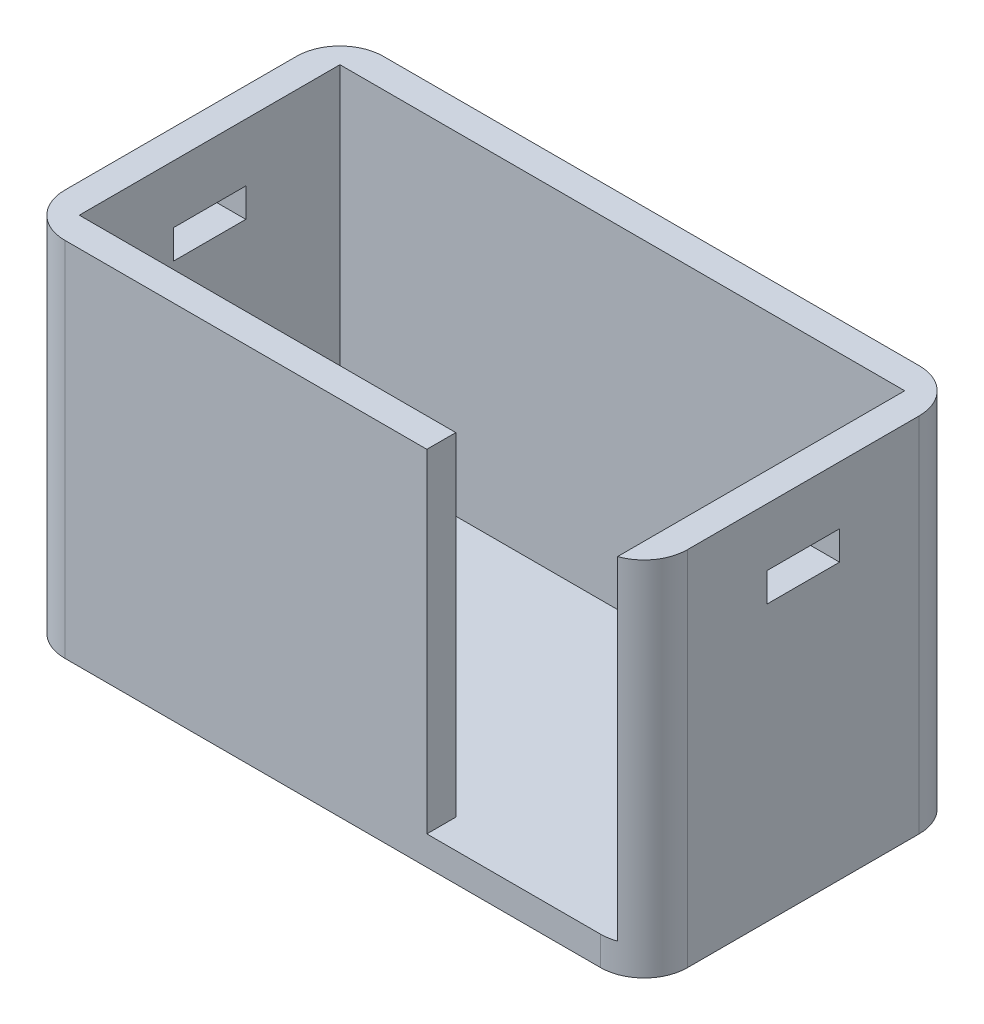
ISO-10303-21;
HEADER;
FILE_DESCRIPTION(('STEP AP214'),'2;1');
FILE_NAME('part.step','',(''),(''),'','','');
FILE_SCHEMA(('AUTOMOTIVE_DESIGN { 1 0 10303 214 1 1 1 1 }'));
ENDSEC;
DATA;
#1=APPLICATION_CONTEXT('core data for automotive mechanical design processes');
#2=APPLICATION_PROTOCOL_DEFINITION('international standard','automotive_design',2000,#1);
#3=PRODUCT_CONTEXT('',#1,'mechanical');
#4=PRODUCT('Part','Part','',(#3));
#5=PRODUCT_RELATED_PRODUCT_CATEGORY('part','',(#4));
#6=PRODUCT_DEFINITION_FORMATION('','',#4);
#7=PRODUCT_DEFINITION_CONTEXT('part definition',#1,'design');
#8=PRODUCT_DEFINITION('design','',#6,#7);
#9=PRODUCT_DEFINITION_SHAPE('','',#8);
#10=(LENGTH_UNIT() NAMED_UNIT(*) SI_UNIT(.MILLI.,.METRE.));
#11=(NAMED_UNIT(*) PLANE_ANGLE_UNIT() SI_UNIT($,.RADIAN.));
#12=(NAMED_UNIT(*) SI_UNIT($,.STERADIAN.) SOLID_ANGLE_UNIT());
#13=UNCERTAINTY_MEASURE_WITH_UNIT(LENGTH_MEASURE(1.E-05),#10,'distance_accuracy_value','');
#14=(GEOMETRIC_REPRESENTATION_CONTEXT(3) GLOBAL_UNCERTAINTY_ASSIGNED_CONTEXT((#13)) GLOBAL_UNIT_ASSIGNED_CONTEXT((#10,
#11,#12)) REPRESENTATION_CONTEXT('',''));
#15=CARTESIAN_POINT('',(0.,0.,0.));
#16=DIRECTION('',(0.,0.,1.));
#17=DIRECTION('',(1.,0.,0.));
#18=AXIS2_PLACEMENT_3D('',#15,#16,#17);
#19=CARTESIAN_POINT('',(26.,0.,20.));
#20=DIRECTION('',(-1.,0.,0.));
#21=DIRECTION('',(0.,-1.,0.));
#22=AXIS2_PLACEMENT_3D('',#19,#20,#21);
#23=PLANE('',#22);
#24=DIRECTION('',(0.,0.,-1.));
#25=VECTOR('',#24,1.);
#26=CARTESIAN_POINT('',(26.,-21.,20.));
#27=LINE('',#26,#25);
#28=CARTESIAN_POINT('',(26.,-21.,20.));
#29=VERTEX_POINT('',#28);
#30=CARTESIAN_POINT('',(26.,-21.,18.));
#31=VERTEX_POINT('',#30);
#32=EDGE_CURVE('E237',#29,#31,#27,.T.);
#33=ORIENTED_EDGE('',*,*,#32,.T.);
#34=DIRECTION('',(0.,1.,0.));
#35=VECTOR('',#34,1.);
#36=CARTESIAN_POINT('',(26.,0.,18.));
#37=LINE('',#36,#35);
#38=CARTESIAN_POINT('',(26.,2.,18.));
#39=VERTEX_POINT('',#38);
#40=EDGE_CURVE('E287',#31,#39,#37,.T.);
#41=ORIENTED_EDGE('',*,*,#40,.T.);
#42=DIRECTION('',(0.,0.,-1.));
#43=VECTOR('',#42,1.);
#44=CARTESIAN_POINT('',(26.,2.,18.));
#45=LINE('',#44,#43);
#46=CARTESIAN_POINT('',(26.,2.,20.));
#47=VERTEX_POINT('',#46);
#48=EDGE_CURVE('E211',#47,#39,#45,.T.);
#49=ORIENTED_EDGE('',*,*,#48,.F.);
#50=DIRECTION('',(0.,1.,0.));
#51=VECTOR('',#50,1.);
#52=CARTESIAN_POINT('',(26.,0.,20.));
#53=LINE('',#52,#51);
#54=EDGE_CURVE('E291',#29,#47,#53,.T.);
#55=ORIENTED_EDGE('',*,*,#54,.F.);
#56=EDGE_LOOP('',(#33,#41,#49,#55));
#57=FACE_BOUND('',#56,.T.);
#58=ADVANCED_FACE('F38',(#57),#23,.F.);
#59=CARTESIAN_POINT('',(-2.,2.,18.));
#60=DIRECTION('',(1.,0.,0.));
#61=DIRECTION('',(0.,0.,-1.));
#62=AXIS2_PLACEMENT_3D('',#59,#60,#61);
#63=PLANE('',#62);
#64=DIRECTION('',(0.,0.,-1.));
#65=VECTOR('',#64,1.);
#66=CARTESIAN_POINT('',(-2.,-3.99999999999999,18.));
#67=LINE('',#66,#65);
#68=CARTESIAN_POINT('',(-2.,-3.99999999999999,11.5));
#69=VERTEX_POINT('',#68);
#70=CARTESIAN_POINT('',(-2.,-3.99999999999998,6.5));
#71=VERTEX_POINT('',#70);
#72=EDGE_CURVE('E259',#69,#71,#67,.T.);
#73=ORIENTED_EDGE('',*,*,#72,.T.);
#74=DIRECTION('',(0.,1.,0.));
#75=VECTOR('',#74,1.);
#76=CARTESIAN_POINT('',(-2.,1.99999999999999,6.49999999999999));
#77=LINE('',#76,#75);
#78=CARTESIAN_POINT('',(-2.,-1.99999999999999,6.5));
#79=VERTEX_POINT('',#78);
#80=EDGE_CURVE('E284',#71,#79,#77,.T.);
#81=ORIENTED_EDGE('',*,*,#80,.T.);
#82=DIRECTION('',(0.,0.,1.));
#83=VECTOR('',#82,1.);
#84=CARTESIAN_POINT('',(-2.,-1.99999999999999,18.));
#85=LINE('',#84,#83);
#86=CARTESIAN_POINT('',(-2.,-1.99999999999999,11.5));
#87=VERTEX_POINT('',#86);
#88=EDGE_CURVE('E276',#79,#87,#85,.T.);
#89=ORIENTED_EDGE('',*,*,#88,.T.);
#90=DIRECTION('',(0.,-1.,0.));
#91=VECTOR('',#90,1.);
#92=CARTESIAN_POINT('',(-2.,2.,11.5));
#93=LINE('',#92,#91);
#94=EDGE_CURVE('E268',#87,#69,#93,.T.);
#95=ORIENTED_EDGE('',*,*,#94,.T.);
#96=EDGE_LOOP('',(#73,#81,#89,#95));
#97=FACE_BOUND('',#96,.T.);
#98=DIRECTION('',(0.,0.,-1.));
#99=VECTOR('',#98,1.);
#100=CARTESIAN_POINT('',(-2.,-23.,18.));
#101=LINE('',#100,#99);
#102=CARTESIAN_POINT('',(-2.,-23.,17.));
#103=VERTEX_POINT('',#102);
#104=CARTESIAN_POINT('',(-2.,-23.,1.));
#105=VERTEX_POINT('',#104);
#106=EDGE_CURVE('E310',#103,#105,#101,.T.);
#107=ORIENTED_EDGE('',*,*,#106,.F.);
#108=DIRECTION('',(0.,-1.,0.));
#109=VECTOR('',#108,1.);
#110=CARTESIAN_POINT('',(-2.,2.,17.));
#111=LINE('',#110,#109);
#112=CARTESIAN_POINT('',(-2.,2.,17.));
#113=VERTEX_POINT('',#112);
#114=EDGE_CURVE('E334',#103,#113,#111,.F.);
#115=ORIENTED_EDGE('',*,*,#114,.T.);
#116=DIRECTION('',(0.,0.,1.));
#117=VECTOR('',#116,1.);
#118=CARTESIAN_POINT('',(-2.,2.,20.));
#119=LINE('',#118,#117);
#120=CARTESIAN_POINT('',(-2.,2.,1.));
#121=VERTEX_POINT('',#120);
#122=EDGE_CURVE('E229',#121,#113,#119,.T.);
#123=ORIENTED_EDGE('',*,*,#122,.F.);
#124=DIRECTION('',(0.,1.,0.));
#125=VECTOR('',#124,1.);
#126=CARTESIAN_POINT('',(-2.,-23.,1.));
#127=LINE('',#126,#125);
#128=EDGE_CURVE('E332',#121,#105,#127,.F.);
#129=ORIENTED_EDGE('',*,*,#128,.T.);
#130=EDGE_LOOP('',(#107,#115,#123,#129));
#131=FACE_BOUND('',#130,.T.);
#132=ADVANCED_FACE('F382',(#97,#131),#63,.F.);
#133=CARTESIAN_POINT('',(41.,2.,18.));
#134=DIRECTION('',(-1.,0.,0.));
#135=DIRECTION('',(0.,0.,1.));
#136=AXIS2_PLACEMENT_3D('',#133,#134,#135);
#137=PLANE('',#136);
#138=DIRECTION('',(0.,0.,-1.));
#139=VECTOR('',#138,1.);
#140=CARTESIAN_POINT('',(41.,-2.,18.));
#141=LINE('',#140,#139);
#142=CARTESIAN_POINT('',(41.,-2.,11.5));
#143=VERTEX_POINT('',#142);
#144=CARTESIAN_POINT('',(41.,-2.,6.5));
#145=VERTEX_POINT('',#144);
#146=EDGE_CURVE('E273',#143,#145,#141,.T.);
#147=ORIENTED_EDGE('',*,*,#146,.T.);
#148=DIRECTION('',(0.,-1.,0.));
#149=VECTOR('',#148,1.);
#150=CARTESIAN_POINT('',(41.,1.99999999999999,6.49999999999999));
#151=LINE('',#150,#149);
#152=CARTESIAN_POINT('',(41.,-4.,6.5));
#153=VERTEX_POINT('',#152);
#154=EDGE_CURVE('E281',#145,#153,#151,.T.);
#155=ORIENTED_EDGE('',*,*,#154,.T.);
#156=DIRECTION('',(0.,0.,1.));
#157=VECTOR('',#156,1.);
#158=CARTESIAN_POINT('',(41.,-4.,18.));
#159=LINE('',#158,#157);
#160=CARTESIAN_POINT('',(41.,-4.,11.5));
#161=VERTEX_POINT('',#160);
#162=EDGE_CURVE('E256',#153,#161,#159,.T.);
#163=ORIENTED_EDGE('',*,*,#162,.T.);
#164=DIRECTION('',(0.,1.,0.));
#165=VECTOR('',#164,1.);
#166=CARTESIAN_POINT('',(41.,2.,11.5));
#167=LINE('',#166,#165);
#168=EDGE_CURVE('E265',#161,#143,#167,.T.);
#169=ORIENTED_EDGE('',*,*,#168,.T.);
#170=EDGE_LOOP('',(#147,#155,#163,#169));
#171=FACE_BOUND('',#170,.T.);
#172=DIRECTION('',(0.,0.,-1.));
#173=VECTOR('',#172,1.);
#174=CARTESIAN_POINT('',(41.,2.,-2.));
#175=LINE('',#174,#173);
#176=CARTESIAN_POINT('',(41.,2.,17.));
#177=VERTEX_POINT('',#176);
#178=CARTESIAN_POINT('',(41.,2.,1.));
#179=VERTEX_POINT('',#178);
#180=EDGE_CURVE('E224',#177,#179,#175,.T.);
#181=ORIENTED_EDGE('',*,*,#180,.F.);
#182=DIRECTION('',(0.,1.,0.));
#183=VECTOR('',#182,1.);
#184=CARTESIAN_POINT('',(41.,-23.,17.));
#185=LINE('',#184,#183);
#186=CARTESIAN_POINT('',(41.,-23.,17.));
#187=VERTEX_POINT('',#186);
#188=EDGE_CURVE('E46',#177,#187,#185,.F.);
#189=ORIENTED_EDGE('',*,*,#188,.T.);
#190=DIRECTION('',(0.,0.,-1.));
#191=VECTOR('',#190,1.);
#192=CARTESIAN_POINT('',(41.,-23.,18.));
#193=LINE('',#192,#191);
#194=CARTESIAN_POINT('',(41.,-23.,1.));
#195=VERTEX_POINT('',#194);
#196=EDGE_CURVE('E308',#187,#195,#193,.T.);
#197=ORIENTED_EDGE('',*,*,#196,.T.);
#198=DIRECTION('',(0.,-1.,0.));
#199=VECTOR('',#198,1.);
#200=CARTESIAN_POINT('',(41.,2.,1.));
#201=LINE('',#200,#199);
#202=EDGE_CURVE('E348',#195,#179,#201,.F.);
#203=ORIENTED_EDGE('',*,*,#202,.T.);
#204=EDGE_LOOP('',(#181,#189,#197,#203));
#205=FACE_BOUND('',#204,.T.);
#206=ADVANCED_FACE('F397',(#171,#205),#137,.F.);
#207=CARTESIAN_POINT('',(0.,0.,-2.));
#208=DIRECTION('',(0.,0.,-1.));
#209=DIRECTION('',(-1.,0.,0.));
#210=AXIS2_PLACEMENT_3D('',#207,#208,#209);
#211=PLANE('',#210);
#212=DIRECTION('',(-1.,0.,0.));
#213=VECTOR('',#212,1.);
#214=CARTESIAN_POINT('',(41.,-23.,-2.));
#215=LINE('',#214,#213);
#216=CARTESIAN_POINT('',(38.,-23.,-2.));
#217=VERTEX_POINT('',#216);
#218=CARTESIAN_POINT('',(1.,-23.,-2.));
#219=VERTEX_POINT('',#218);
#220=EDGE_CURVE('E294',#217,#219,#215,.T.);
#221=ORIENTED_EDGE('',*,*,#220,.T.);
#222=DIRECTION('',(0.,1.,0.));
#223=VECTOR('',#222,1.);
#224=CARTESIAN_POINT('',(1.,2.,-2.));
#225=LINE('',#224,#223);
#226=CARTESIAN_POINT('',(1.,2.,-2.));
#227=VERTEX_POINT('',#226);
#228=EDGE_CURVE('E345',#219,#227,#225,.T.);
#229=ORIENTED_EDGE('',*,*,#228,.T.);
#230=DIRECTION('',(-1.,0.,0.));
#231=VECTOR('',#230,1.);
#232=CARTESIAN_POINT('',(-2.,2.,-2.));
#233=LINE('',#232,#231);
#234=CARTESIAN_POINT('',(38.,2.,-2.));
#235=VERTEX_POINT('',#234);
#236=EDGE_CURVE('E226',#235,#227,#233,.T.);
#237=ORIENTED_EDGE('',*,*,#236,.F.);
#238=DIRECTION('',(0.,-1.,0.));
#239=VECTOR('',#238,1.);
#240=CARTESIAN_POINT('',(38.,-23.,-2.));
#241=LINE('',#240,#239);
#242=EDGE_CURVE('E342',#235,#217,#241,.T.);
#243=ORIENTED_EDGE('',*,*,#242,.T.);
#244=EDGE_LOOP('',(#221,#229,#237,#243));
#245=FACE_BOUND('',#244,.T.);
#246=ADVANCED_FACE('F390',(#245),#211,.T.);
#247=CARTESIAN_POINT('',(-2.,-23.,18.));
#248=DIRECTION('',(0.,1.,0.));
#249=DIRECTION('',(-1.,0.,0.));
#250=AXIS2_PLACEMENT_3D('',#247,#248,#249);
#251=PLANE('',#250);
#252=CARTESIAN_POINT('',(29.5,-23.,7.00000000000002));
#253=DIRECTION('',(0.,-1.,0.));
#254=DIRECTION('',(1.,0.,0.));
#255=AXIS2_PLACEMENT_3D('',#252,#253,#254);
#256=CIRCLE('',#255,1.25);
#257=CARTESIAN_POINT('',(30.75,-23.,7.00000000000002));
#258=VERTEX_POINT('',#257);
#259=EDGE_CURVE('E215',#258,#258,#256,.T.);
#260=ORIENTED_EDGE('',*,*,#259,.F.);
#261=EDGE_LOOP('',(#260));
#262=FACE_BOUND('',#261,.T.);
#263=CARTESIAN_POINT('',(9.5,-23.,7.));
#264=DIRECTION('',(0.,-1.,0.));
#265=DIRECTION('',(1.,0.,0.));
#266=AXIS2_PLACEMENT_3D('',#263,#264,#265);
#267=CIRCLE('',#266,1.25);
#268=CARTESIAN_POINT('',(10.75,-23.,7.));
#269=VERTEX_POINT('',#268);
#270=EDGE_CURVE('E768',#269,#269,#267,.T.);
#271=ORIENTED_EDGE('',*,*,#270,.F.);
#272=EDGE_LOOP('',(#271));
#273=FACE_BOUND('',#272,.T.);
#274=ORIENTED_EDGE('',*,*,#196,.F.);
#275=CARTESIAN_POINT('',(38.,-23.,17.));
#276=DIRECTION('',(0.,1.,0.));
#277=DIRECTION('',(-1.,0.,0.));
#278=AXIS2_PLACEMENT_3D('',#275,#276,#277);
#279=CIRCLE('',#278,3.);
#280=CARTESIAN_POINT('',(38.,-23.,20.));
#281=VERTEX_POINT('',#280);
#282=EDGE_CURVE('E11',#187,#281,#279,.F.);
#283=ORIENTED_EDGE('',*,*,#282,.T.);
#284=DIRECTION('',(1.,0.,0.));
#285=VECTOR('',#284,1.);
#286=CARTESIAN_POINT('',(-2.,-23.,20.));
#287=LINE('',#286,#285);
#288=CARTESIAN_POINT('',(1.,-23.,20.));
#289=VERTEX_POINT('',#288);
#290=EDGE_CURVE('E288',#289,#281,#287,.T.);
#291=ORIENTED_EDGE('',*,*,#290,.F.);
#292=CARTESIAN_POINT('',(1.,-23.,17.));
#293=DIRECTION('',(0.,1.,0.));
#294=DIRECTION('',(-1.,0.,0.));
#295=AXIS2_PLACEMENT_3D('',#292,#293,#294);
#296=CIRCLE('',#295,3.);
#297=EDGE_CURVE('E330',#289,#103,#296,.F.);
#298=ORIENTED_EDGE('',*,*,#297,.T.);
#299=ORIENTED_EDGE('',*,*,#106,.T.);
#300=CARTESIAN_POINT('',(1.,-23.,1.));
#301=DIRECTION('',(0.,1.,0.));
#302=DIRECTION('',(-1.,0.,0.));
#303=AXIS2_PLACEMENT_3D('',#300,#301,#302);
#304=CIRCLE('',#303,3.);
#305=EDGE_CURVE('E328',#105,#219,#304,.F.);
#306=ORIENTED_EDGE('',*,*,#305,.T.);
#307=ORIENTED_EDGE('',*,*,#220,.F.);
#308=CARTESIAN_POINT('',(38.,-23.,1.));
#309=DIRECTION('',(0.,1.,0.));
#310=DIRECTION('',(-1.,0.,0.));
#311=AXIS2_PLACEMENT_3D('',#308,#309,#310);
#312=CIRCLE('',#311,3.);
#313=EDGE_CURVE('E325',#217,#195,#312,.F.);
#314=ORIENTED_EDGE('',*,*,#313,.T.);
#315=EDGE_LOOP('',(#274,#283,#291,#298,#299,#306,#307,#314));
#316=FACE_BOUND('',#315,.T.);
#317=ADVANCED_FACE('F369',(#262,#273,#316),#251,.F.);
#318=CARTESIAN_POINT('',(0.,0.,18.));
#319=DIRECTION('',(1.,0.,0.));
#320=DIRECTION('',(0.,1.,0.));
#321=AXIS2_PLACEMENT_3D('',#318,#319,#320);
#322=PLANE('',#321);
#323=DIRECTION('',(0.,1.,0.));
#324=VECTOR('',#323,1.);
#325=CARTESIAN_POINT('',(0.,0.,6.5));
#326=LINE('',#325,#324);
#327=CARTESIAN_POINT('',(0.,-3.99999999999999,6.5));
#328=VERTEX_POINT('',#327);
#329=CARTESIAN_POINT('',(0.,-1.99999999999999,6.5));
#330=VERTEX_POINT('',#329);
#331=EDGE_CURVE('E279',#328,#330,#326,.T.);
#332=ORIENTED_EDGE('',*,*,#331,.F.);
#333=DIRECTION('',(0.,0.,-1.));
#334=VECTOR('',#333,1.);
#335=CARTESIAN_POINT('',(0.,-3.99999999999999,18.));
#336=LINE('',#335,#334);
#337=CARTESIAN_POINT('',(0.,-3.99999999999999,11.5));
#338=VERTEX_POINT('',#337);
#339=EDGE_CURVE('E254',#338,#328,#336,.T.);
#340=ORIENTED_EDGE('',*,*,#339,.F.);
#341=DIRECTION('',(0.,-1.,0.));
#342=VECTOR('',#341,1.);
#343=CARTESIAN_POINT('',(0.,0.,11.5));
#344=LINE('',#343,#342);
#345=CARTESIAN_POINT('',(0.,-1.99999999999999,11.5));
#346=VERTEX_POINT('',#345);
#347=EDGE_CURVE('E262',#346,#338,#344,.T.);
#348=ORIENTED_EDGE('',*,*,#347,.F.);
#349=DIRECTION('',(0.,0.,1.));
#350=VECTOR('',#349,1.);
#351=CARTESIAN_POINT('',(0.,-1.99999999999999,18.));
#352=LINE('',#351,#350);
#353=EDGE_CURVE('E271',#330,#346,#352,.T.);
#354=ORIENTED_EDGE('',*,*,#353,.F.);
#355=EDGE_LOOP('',(#332,#340,#348,#354));
#356=FACE_BOUND('',#355,.T.);
#357=DIRECTION('',(0.,-1.,0.));
#358=VECTOR('',#357,1.);
#359=CARTESIAN_POINT('',(0.,0.,0.));
#360=LINE('',#359,#358);
#361=CARTESIAN_POINT('',(0.,2.,0.));
#362=VERTEX_POINT('',#361);
#363=CARTESIAN_POINT('',(0.,-21.,0.));
#364=VERTEX_POINT('',#363);
#365=EDGE_CURVE('E203',#362,#364,#360,.T.);
#366=ORIENTED_EDGE('',*,*,#365,.F.);
#367=DIRECTION('',(0.,0.,-1.));
#368=VECTOR('',#367,1.);
#369=CARTESIAN_POINT('',(0.,2.,0.));
#370=LINE('',#369,#368);
#371=CARTESIAN_POINT('',(0.,2.,18.));
#372=VERTEX_POINT('',#371);
#373=EDGE_CURVE('E200',#372,#362,#370,.T.);
#374=ORIENTED_EDGE('',*,*,#373,.F.);
#375=DIRECTION('',(0.,-1.,0.));
#376=VECTOR('',#375,1.);
#377=CARTESIAN_POINT('',(0.,0.,18.));
#378=LINE('',#377,#376);
#379=CARTESIAN_POINT('',(0.,-21.,18.));
#380=VERTEX_POINT('',#379);
#381=EDGE_CURVE('E186',#372,#380,#378,.T.);
#382=ORIENTED_EDGE('',*,*,#381,.T.);
#383=DIRECTION('',(0.,0.,-1.));
#384=VECTOR('',#383,1.);
#385=CARTESIAN_POINT('',(0.,-21.,18.));
#386=LINE('',#385,#384);
#387=EDGE_CURVE('E306',#380,#364,#386,.T.);
#388=ORIENTED_EDGE('',*,*,#387,.T.);
#389=EDGE_LOOP('',(#366,#374,#382,#388));
#390=FACE_BOUND('',#389,.T.);
#391=ADVANCED_FACE('F201',(#356,#390),#322,.T.);
#392=CARTESIAN_POINT('',(0.,-21.,18.));
#393=DIRECTION('',(0.,1.,0.));
#394=DIRECTION('',(-1.,0.,0.));
#395=AXIS2_PLACEMENT_3D('',#392,#393,#394);
#396=PLANE('',#395);
#397=CARTESIAN_POINT('',(29.5,-21.,7.00000000000002));
#398=DIRECTION('',(0.,-1.,0.));
#399=DIRECTION('',(1.,0.,0.));
#400=AXIS2_PLACEMENT_3D('',#397,#398,#399);
#401=CIRCLE('',#400,1.25);
#402=CARTESIAN_POINT('',(30.75,-21.,7.00000000000002));
#403=VERTEX_POINT('',#402);
#404=EDGE_CURVE('E212',#403,#403,#401,.T.);
#405=ORIENTED_EDGE('',*,*,#404,.T.);
#406=EDGE_LOOP('',(#405));
#407=FACE_BOUND('',#406,.T.);
#408=CARTESIAN_POINT('',(9.5,-21.,7.));
#409=DIRECTION('',(0.,-1.,0.));
#410=DIRECTION('',(1.,0.,0.));
#411=AXIS2_PLACEMENT_3D('',#408,#409,#410);
#412=CIRCLE('',#411,1.25);
#413=CARTESIAN_POINT('',(10.75,-21.,7.));
#414=VERTEX_POINT('',#413);
#415=EDGE_CURVE('E218',#414,#414,#412,.T.);
#416=ORIENTED_EDGE('',*,*,#415,.T.);
#417=EDGE_LOOP('',(#416));
#418=FACE_BOUND('',#417,.T.);
#419=DIRECTION('',(-1.,0.,0.));
#420=VECTOR('',#419,1.);
#421=CARTESIAN_POINT('',(26.,-21.,20.));
#422=LINE('',#421,#420);
#423=CARTESIAN_POINT('',(38.,-21.,20.));
#424=VERTEX_POINT('',#423);
#425=EDGE_CURVE('E235',#424,#29,#422,.T.);
#426=ORIENTED_EDGE('',*,*,#425,.F.);
#427=CARTESIAN_POINT('',(38.,-21.,17.));
#428=DIRECTION('',(0.,1.,0.));
#429=DIRECTION('',(-1.,0.,0.));
#430=AXIS2_PLACEMENT_3D('',#427,#428,#429);
#431=CIRCLE('',#430,3.);
#432=CARTESIAN_POINT('',(39.,-21.,19.8284271247462));
#433=VERTEX_POINT('',#432);
#434=EDGE_CURVE('E354',#424,#433,#431,.T.);
#435=ORIENTED_EDGE('',*,*,#434,.T.);
#436=DIRECTION('',(0.,0.,-1.));
#437=VECTOR('',#436,1.);
#438=CARTESIAN_POINT('',(39.,-21.,18.));
#439=LINE('',#438,#437);
#440=CARTESIAN_POINT('',(39.,-21.,0.));
#441=VERTEX_POINT('',#440);
#442=EDGE_CURVE('E299',#433,#441,#439,.T.);
#443=ORIENTED_EDGE('',*,*,#442,.T.);
#444=DIRECTION('',(1.,0.,0.));
#445=VECTOR('',#444,1.);
#446=CARTESIAN_POINT('',(0.,-21.,0.));
#447=LINE('',#446,#445);
#448=EDGE_CURVE('E301',#364,#441,#447,.T.);
#449=ORIENTED_EDGE('',*,*,#448,.F.);
#450=ORIENTED_EDGE('',*,*,#387,.F.);
#451=DIRECTION('',(1.,0.,0.));
#452=VECTOR('',#451,1.);
#453=CARTESIAN_POINT('',(0.,-21.,18.));
#454=LINE('',#453,#452);
#455=EDGE_CURVE('E193',#380,#31,#454,.T.);
#456=ORIENTED_EDGE('',*,*,#455,.T.);
#457=ORIENTED_EDGE('',*,*,#32,.F.);
#458=EDGE_LOOP('',(#426,#435,#443,#449,#450,#456,#457));
#459=FACE_BOUND('',#458,.T.);
#460=ADVANCED_FACE('F402',(#407,#418,#459),#396,.T.);
#461=CARTESIAN_POINT('',(39.,0.,18.));
#462=DIRECTION('',(-1.,0.,0.));
#463=DIRECTION('',(0.,-1.,0.));
#464=AXIS2_PLACEMENT_3D('',#461,#462,#463);
#465=PLANE('',#464);
#466=DIRECTION('',(0.,-1.,0.));
#467=VECTOR('',#466,1.);
#468=CARTESIAN_POINT('',(39.,0.,6.5));
#469=LINE('',#468,#467);
#470=CARTESIAN_POINT('',(39.,-2.,6.5));
#471=VERTEX_POINT('',#470);
#472=CARTESIAN_POINT('',(39.,-4.,6.5));
#473=VERTEX_POINT('',#472);
#474=EDGE_CURVE('E319',#471,#473,#469,.T.);
#475=ORIENTED_EDGE('',*,*,#474,.F.);
#476=DIRECTION('',(0.,0.,-1.));
#477=VECTOR('',#476,1.);
#478=CARTESIAN_POINT('',(39.,-2.,18.));
#479=LINE('',#478,#477);
#480=CARTESIAN_POINT('',(39.,-2.,11.5));
#481=VERTEX_POINT('',#480);
#482=EDGE_CURVE('E317',#481,#471,#479,.T.);
#483=ORIENTED_EDGE('',*,*,#482,.F.);
#484=DIRECTION('',(0.,1.,0.));
#485=VECTOR('',#484,1.);
#486=CARTESIAN_POINT('',(39.,0.,11.5));
#487=LINE('',#486,#485);
#488=CARTESIAN_POINT('',(39.,-4.,11.5));
#489=VERTEX_POINT('',#488);
#490=EDGE_CURVE('E315',#489,#481,#487,.T.);
#491=ORIENTED_EDGE('',*,*,#490,.F.);
#492=DIRECTION('',(0.,0.,1.));
#493=VECTOR('',#492,1.);
#494=CARTESIAN_POINT('',(39.,-4.,18.));
#495=LINE('',#494,#493);
#496=EDGE_CURVE('E313',#473,#489,#495,.T.);
#497=ORIENTED_EDGE('',*,*,#496,.F.);
#498=EDGE_LOOP('',(#475,#483,#491,#497));
#499=FACE_BOUND('',#498,.T.);
#500=ORIENTED_EDGE('',*,*,#442,.F.);
#501=DIRECTION('',(0.,-1.,0.));
#502=VECTOR('',#501,1.);
#503=CARTESIAN_POINT('',(39.,-21.,19.8284271247462));
#504=LINE('',#503,#502);
#505=CARTESIAN_POINT('',(39.,2.,19.8284271247462));
#506=VERTEX_POINT('',#505);
#507=EDGE_CURVE('E356',#433,#506,#504,.F.);
#508=ORIENTED_EDGE('',*,*,#507,.T.);
#509=DIRECTION('',(0.,0.,1.));
#510=VECTOR('',#509,1.);
#511=CARTESIAN_POINT('',(39.,2.,20.));
#512=LINE('',#511,#510);
#513=CARTESIAN_POINT('',(39.,2.,0.));
#514=VERTEX_POINT('',#513);
#515=EDGE_CURVE('E222',#514,#506,#512,.T.);
#516=ORIENTED_EDGE('',*,*,#515,.F.);
#517=DIRECTION('',(0.,1.,0.));
#518=VECTOR('',#517,1.);
#519=CARTESIAN_POINT('',(39.,0.,0.));
#520=LINE('',#519,#518);
#521=EDGE_CURVE('E197',#441,#514,#520,.T.);
#522=ORIENTED_EDGE('',*,*,#521,.F.);
#523=EDGE_LOOP('',(#500,#508,#516,#522));
#524=FACE_BOUND('',#523,.T.);
#525=ADVANCED_FACE('F362',(#499,#524),#465,.T.);
#526=CARTESIAN_POINT('',(0.,0.,0.));
#527=DIRECTION('',(0.,0.,-1.));
#528=DIRECTION('',(-1.,0.,0.));
#529=AXIS2_PLACEMENT_3D('',#526,#527,#528);
#530=PLANE('',#529);
#531=ORIENTED_EDGE('',*,*,#521,.T.);
#532=DIRECTION('',(1.,0.,0.));
#533=VECTOR('',#532,1.);
#534=CARTESIAN_POINT('',(39.,2.,0.));
#535=LINE('',#534,#533);
#536=EDGE_CURVE('E206',#362,#514,#535,.T.);
#537=ORIENTED_EDGE('',*,*,#536,.F.);
#538=ORIENTED_EDGE('',*,*,#365,.T.);
#539=ORIENTED_EDGE('',*,*,#448,.T.);
#540=EDGE_LOOP('',(#531,#537,#538,#539));
#541=FACE_BOUND('',#540,.T.);
#542=ADVANCED_FACE('F404',(#541),#530,.F.);
#543=CARTESIAN_POINT('',(0.,0.,20.));
#544=DIRECTION('',(0.,0.,1.));
#545=DIRECTION('',(1.,0.,0.));
#546=AXIS2_PLACEMENT_3D('',#543,#544,#545);
#547=PLANE('',#546);
#548=ORIENTED_EDGE('',*,*,#290,.T.);
#549=DIRECTION('',(0.,1.,0.));
#550=VECTOR('',#549,1.);
#551=CARTESIAN_POINT('',(38.,2.,20.));
#552=LINE('',#551,#550);
#553=EDGE_CURVE('E351',#281,#424,#552,.T.);
#554=ORIENTED_EDGE('',*,*,#553,.T.);
#555=ORIENTED_EDGE('',*,*,#425,.T.);
#556=ORIENTED_EDGE('',*,*,#54,.T.);
#557=DIRECTION('',(1.,0.,0.));
#558=VECTOR('',#557,1.);
#559=CARTESIAN_POINT('',(26.,2.,20.));
#560=LINE('',#559,#558);
#561=CARTESIAN_POINT('',(1.,2.,20.));
#562=VERTEX_POINT('',#561);
#563=EDGE_CURVE('E232',#562,#47,#560,.T.);
#564=ORIENTED_EDGE('',*,*,#563,.F.);
#565=DIRECTION('',(0.,-1.,0.));
#566=VECTOR('',#565,1.);
#567=CARTESIAN_POINT('',(1.,-23.,20.));
#568=LINE('',#567,#566);
#569=EDGE_CURVE('E322',#562,#289,#568,.T.);
#570=ORIENTED_EDGE('',*,*,#569,.T.);
#571=EDGE_LOOP('',(#548,#554,#555,#556,#564,#570));
#572=FACE_BOUND('',#571,.T.);
#573=ADVANCED_FACE('F371',(#572),#547,.T.);
#574=CARTESIAN_POINT('',(0.,0.,18.));
#575=DIRECTION('',(0.,0.,1.));
#576=DIRECTION('',(1.,0.,0.));
#577=AXIS2_PLACEMENT_3D('',#574,#575,#576);
#578=PLANE('',#577);
#579=ORIENTED_EDGE('',*,*,#455,.F.);
#580=ORIENTED_EDGE('',*,*,#381,.F.);
#581=DIRECTION('',(-1.,0.,0.));
#582=VECTOR('',#581,1.);
#583=CARTESIAN_POINT('',(0.,2.,18.));
#584=LINE('',#583,#582);
#585=EDGE_CURVE('E191',#39,#372,#584,.T.);
#586=ORIENTED_EDGE('',*,*,#585,.F.);
#587=ORIENTED_EDGE('',*,*,#40,.F.);
#588=EDGE_LOOP('',(#579,#580,#586,#587));
#589=FACE_BOUND('',#588,.T.);
#590=ADVANCED_FACE('F188',(#589),#578,.F.);
#591=CARTESIAN_POINT('',(96.5,-4.00000000000002,6.5));
#592=DIRECTION('',(0.,-1.,0.));
#593=DIRECTION('',(1.,0.,0.));
#594=AXIS2_PLACEMENT_3D('',#591,#592,#593);
#595=PLANE('',#594);
#596=DIRECTION('',(-1.,0.,0.));
#597=VECTOR('',#596,1.);
#598=CARTESIAN_POINT('',(96.5,-4.00000000000002,6.5));
#599=LINE('',#598,#597);
#600=EDGE_CURVE('E252',#153,#473,#599,.T.);
#601=ORIENTED_EDGE('',*,*,#600,.T.);
#602=ORIENTED_EDGE('',*,*,#496,.T.);
#603=DIRECTION('',(-1.,0.,0.));
#604=VECTOR('',#603,1.);
#605=CARTESIAN_POINT('',(96.5,-4.00000000000002,11.5));
#606=LINE('',#605,#604);
#607=EDGE_CURVE('E248',#161,#489,#606,.T.);
#608=ORIENTED_EDGE('',*,*,#607,.F.);
#609=ORIENTED_EDGE('',*,*,#162,.F.);
#610=EDGE_LOOP('',(#601,#602,#608,#609));
#611=FACE_BOUND('',#610,.T.);
#612=ADVANCED_FACE('F512',(#611),#595,.F.);
#613=CARTESIAN_POINT('',(96.5,-2.00000000000002,11.5));
#614=DIRECTION('',(0.,0.,1.));
#615=DIRECTION('',(1.,0.,0.));
#616=AXIS2_PLACEMENT_3D('',#613,#614,#615);
#617=PLANE('',#616);
#618=ORIENTED_EDGE('',*,*,#607,.T.);
#619=ORIENTED_EDGE('',*,*,#490,.T.);
#620=DIRECTION('',(-1.,0.,0.));
#621=VECTOR('',#620,1.);
#622=CARTESIAN_POINT('',(96.5,-2.00000000000002,11.5));
#623=LINE('',#622,#621);
#624=EDGE_CURVE('E244',#143,#481,#623,.T.);
#625=ORIENTED_EDGE('',*,*,#624,.F.);
#626=ORIENTED_EDGE('',*,*,#168,.F.);
#627=EDGE_LOOP('',(#618,#619,#625,#626));
#628=FACE_BOUND('',#627,.T.);
#629=ADVANCED_FACE('F588',(#628),#617,.F.);
#630=CARTESIAN_POINT('',(96.5,-2.00000000000002,6.5));
#631=DIRECTION('',(0.,1.,0.));
#632=DIRECTION('',(-1.,0.,0.));
#633=AXIS2_PLACEMENT_3D('',#630,#631,#632);
#634=PLANE('',#633);
#635=ORIENTED_EDGE('',*,*,#624,.T.);
#636=ORIENTED_EDGE('',*,*,#482,.T.);
#637=DIRECTION('',(-1.,0.,0.));
#638=VECTOR('',#637,1.);
#639=CARTESIAN_POINT('',(96.5,-2.00000000000002,6.5));
#640=LINE('',#639,#638);
#641=EDGE_CURVE('E243',#145,#471,#640,.T.);
#642=ORIENTED_EDGE('',*,*,#641,.F.);
#643=ORIENTED_EDGE('',*,*,#146,.F.);
#644=EDGE_LOOP('',(#635,#636,#642,#643));
#645=FACE_BOUND('',#644,.T.);
#646=ADVANCED_FACE('F598',(#645),#634,.F.);
#647=CARTESIAN_POINT('',(96.5,-2.00000000000002,6.5));
#648=DIRECTION('',(0.,0.,-1.));
#649=DIRECTION('',(0.,1.,0.));
#650=AXIS2_PLACEMENT_3D('',#647,#648,#649);
#651=PLANE('',#650);
#652=ORIENTED_EDGE('',*,*,#641,.T.);
#653=ORIENTED_EDGE('',*,*,#474,.T.);
#654=ORIENTED_EDGE('',*,*,#600,.F.);
#655=ORIENTED_EDGE('',*,*,#154,.F.);
#656=EDGE_LOOP('',(#652,#653,#654,#655));
#657=FACE_BOUND('',#656,.T.);
#658=ADVANCED_FACE('F609',(#657),#651,.F.);
#659=EDGE_CURVE('E239',#328,#71,#599,.T.);
#660=ORIENTED_EDGE('',*,*,#659,.F.);
#661=ORIENTED_EDGE('',*,*,#331,.T.);
#662=EDGE_CURVE('E240',#330,#79,#640,.T.);
#663=ORIENTED_EDGE('',*,*,#662,.T.);
#664=ORIENTED_EDGE('',*,*,#80,.F.);
#665=EDGE_LOOP('',(#660,#661,#663,#664));
#666=FACE_BOUND('',#665,.T.);
#667=ADVANCED_FACE('F620',(#666),#651,.F.);
#668=ORIENTED_EDGE('',*,*,#662,.F.);
#669=ORIENTED_EDGE('',*,*,#353,.T.);
#670=EDGE_CURVE('E245',#346,#87,#623,.T.);
#671=ORIENTED_EDGE('',*,*,#670,.T.);
#672=ORIENTED_EDGE('',*,*,#88,.F.);
#673=EDGE_LOOP('',(#668,#669,#671,#672));
#674=FACE_BOUND('',#673,.T.);
#675=ADVANCED_FACE('F612',(#674),#634,.F.);
#676=ORIENTED_EDGE('',*,*,#670,.F.);
#677=ORIENTED_EDGE('',*,*,#347,.T.);
#678=EDGE_CURVE('E249',#338,#69,#606,.T.);
#679=ORIENTED_EDGE('',*,*,#678,.T.);
#680=ORIENTED_EDGE('',*,*,#94,.F.);
#681=EDGE_LOOP('',(#676,#677,#679,#680));
#682=FACE_BOUND('',#681,.T.);
#683=ADVANCED_FACE('F601',(#682),#617,.F.);
#684=ORIENTED_EDGE('',*,*,#678,.F.);
#685=ORIENTED_EDGE('',*,*,#339,.T.);
#686=ORIENTED_EDGE('',*,*,#659,.T.);
#687=ORIENTED_EDGE('',*,*,#72,.F.);
#688=EDGE_LOOP('',(#684,#685,#686,#687));
#689=FACE_BOUND('',#688,.T.);
#690=ADVANCED_FACE('F461',(#689),#595,.F.);
#691=CARTESIAN_POINT('',(0.,2.,0.));
#692=DIRECTION('',(0.,-1.,0.));
#693=DIRECTION('',(0.,0.,-1.));
#694=AXIS2_PLACEMENT_3D('',#691,#692,#693);
#695=PLANE('',#694);
#696=ORIENTED_EDGE('',*,*,#515,.T.);
#697=CARTESIAN_POINT('',(38.,2.,17.));
#698=DIRECTION('',(0.,-1.,0.));
#699=DIRECTION('',(0.,0.,-1.));
#700=AXIS2_PLACEMENT_3D('',#697,#698,#699);
#701=CIRCLE('',#700,3.);
#702=EDGE_CURVE('E60',#506,#177,#701,.F.);
#703=ORIENTED_EDGE('',*,*,#702,.T.);
#704=ORIENTED_EDGE('',*,*,#180,.T.);
#705=CARTESIAN_POINT('',(38.,2.,1.));
#706=DIRECTION('',(0.,-1.,0.));
#707=DIRECTION('',(0.,0.,-1.));
#708=AXIS2_PLACEMENT_3D('',#705,#706,#707);
#709=CIRCLE('',#708,3.);
#710=EDGE_CURVE('E336',#179,#235,#709,.F.);
#711=ORIENTED_EDGE('',*,*,#710,.T.);
#712=ORIENTED_EDGE('',*,*,#236,.T.);
#713=CARTESIAN_POINT('',(1.,2.,1.));
#714=DIRECTION('',(0.,-1.,0.));
#715=DIRECTION('',(0.,0.,-1.));
#716=AXIS2_PLACEMENT_3D('',#713,#714,#715);
#717=CIRCLE('',#716,3.);
#718=EDGE_CURVE('E338',#227,#121,#717,.F.);
#719=ORIENTED_EDGE('',*,*,#718,.T.);
#720=ORIENTED_EDGE('',*,*,#122,.T.);
#721=CARTESIAN_POINT('',(1.,2.,17.));
#722=DIRECTION('',(0.,-1.,0.));
#723=DIRECTION('',(0.,0.,-1.));
#724=AXIS2_PLACEMENT_3D('',#721,#722,#723);
#725=CIRCLE('',#724,3.);
#726=EDGE_CURVE('E340',#113,#562,#725,.F.);
#727=ORIENTED_EDGE('',*,*,#726,.T.);
#728=ORIENTED_EDGE('',*,*,#563,.T.);
#729=ORIENTED_EDGE('',*,*,#48,.T.);
#730=ORIENTED_EDGE('',*,*,#585,.T.);
#731=ORIENTED_EDGE('',*,*,#373,.T.);
#732=ORIENTED_EDGE('',*,*,#536,.T.);
#733=EDGE_LOOP('',(#696,#703,#704,#711,#712,#719,#720,#727,#728,#729,#730,#731,#732));
#734=FACE_BOUND('',#733,.T.);
#735=ADVANCED_FACE('F209',(#734),#695,.F.);
#736=CARTESIAN_POINT('',(9.5,-21.,7.));
#737=DIRECTION('',(0.,-1.,0.));
#738=DIRECTION('',(1.,0.,0.));
#739=AXIS2_PLACEMENT_3D('',#736,#737,#738);
#740=CYLINDRICAL_SURFACE('',#739,1.25);
#741=ORIENTED_EDGE('',*,*,#415,.F.);
#742=EDGE_LOOP('',(#741));
#743=FACE_BOUND('',#742,.T.);
#744=ORIENTED_EDGE('',*,*,#270,.T.);
#745=EDGE_LOOP('',(#744));
#746=FACE_BOUND('',#745,.T.);
#747=ADVANCED_FACE('F460',(#743,#746),#740,.F.);
#748=CARTESIAN_POINT('',(29.5,-21.,7.00000000000002));
#749=DIRECTION('',(0.,-1.,0.));
#750=DIRECTION('',(1.,0.,0.));
#751=AXIS2_PLACEMENT_3D('',#748,#749,#750);
#752=CYLINDRICAL_SURFACE('',#751,1.25);
#753=ORIENTED_EDGE('',*,*,#404,.F.);
#754=EDGE_LOOP('',(#753));
#755=FACE_BOUND('',#754,.T.);
#756=ORIENTED_EDGE('',*,*,#259,.T.);
#757=EDGE_LOOP('',(#756));
#758=FACE_BOUND('',#757,.T.);
#759=ADVANCED_FACE('F444',(#755,#758),#752,.F.);
#760=CARTESIAN_POINT('',(1.,0.,17.));
#761=DIRECTION('',(0.,1.,0.));
#762=DIRECTION('',(0.,0.,1.));
#763=AXIS2_PLACEMENT_3D('',#760,#761,#762);
#764=CYLINDRICAL_SURFACE('',#763,3.);
#765=ORIENTED_EDGE('',*,*,#726,.F.);
#766=ORIENTED_EDGE('',*,*,#114,.F.);
#767=ORIENTED_EDGE('',*,*,#297,.F.);
#768=ORIENTED_EDGE('',*,*,#569,.F.);
#769=EDGE_LOOP('',(#765,#766,#767,#768));
#770=FACE_BOUND('',#769,.T.);
#771=ADVANCED_FACE('F377',(#770),#764,.T.);
#772=CARTESIAN_POINT('',(1.,0.,1.));
#773=DIRECTION('',(0.,-1.,0.));
#774=DIRECTION('',(0.,0.,-1.));
#775=AXIS2_PLACEMENT_3D('',#772,#773,#774);
#776=CYLINDRICAL_SURFACE('',#775,3.);
#777=ORIENTED_EDGE('',*,*,#305,.F.);
#778=ORIENTED_EDGE('',*,*,#128,.F.);
#779=ORIENTED_EDGE('',*,*,#718,.F.);
#780=ORIENTED_EDGE('',*,*,#228,.F.);
#781=EDGE_LOOP('',(#777,#778,#779,#780));
#782=FACE_BOUND('',#781,.T.);
#783=ADVANCED_FACE('F386',(#782),#776,.T.);
#784=CARTESIAN_POINT('',(38.,0.,1.));
#785=DIRECTION('',(0.,1.,0.));
#786=DIRECTION('',(0.,0.,1.));
#787=AXIS2_PLACEMENT_3D('',#784,#785,#786);
#788=CYLINDRICAL_SURFACE('',#787,3.);
#789=ORIENTED_EDGE('',*,*,#710,.F.);
#790=ORIENTED_EDGE('',*,*,#202,.F.);
#791=ORIENTED_EDGE('',*,*,#313,.F.);
#792=ORIENTED_EDGE('',*,*,#242,.F.);
#793=EDGE_LOOP('',(#789,#790,#791,#792));
#794=FACE_BOUND('',#793,.T.);
#795=ADVANCED_FACE('F395',(#794),#788,.T.);
#796=CARTESIAN_POINT('',(38.,0.,17.));
#797=DIRECTION('',(0.,-1.,0.));
#798=DIRECTION('',(0.,0.,-1.));
#799=AXIS2_PLACEMENT_3D('',#796,#797,#798);
#800=CYLINDRICAL_SURFACE('',#799,3.);
#801=ORIENTED_EDGE('',*,*,#282,.F.);
#802=ORIENTED_EDGE('',*,*,#188,.F.);
#803=ORIENTED_EDGE('',*,*,#702,.F.);
#804=ORIENTED_EDGE('',*,*,#507,.F.);
#805=ORIENTED_EDGE('',*,*,#434,.F.);
#806=ORIENTED_EDGE('',*,*,#553,.F.);
#807=EDGE_LOOP('',(#801,#802,#803,#804,#805,#806));
#808=FACE_BOUND('',#807,.T.);
#809=ADVANCED_FACE('F40',(#808),#800,.T.);
#810=CLOSED_SHELL('',(#58,#132,#206,#246,#317,#391,#460,#525,#542,#573,#590,#612,#629,#646,#658,
#667,#675,#683,#690,#735,#747,#759,#771,#783,#795,#809));
#811=MANIFOLD_SOLID_BREP('B2',#810);
#812=ADVANCED_BREP_SHAPE_REPRESENTATION('',(#18,#811),#14);
#813=SHAPE_DEFINITION_REPRESENTATION(#9,#812);
ENDSEC;
END-ISO-10303-21;
